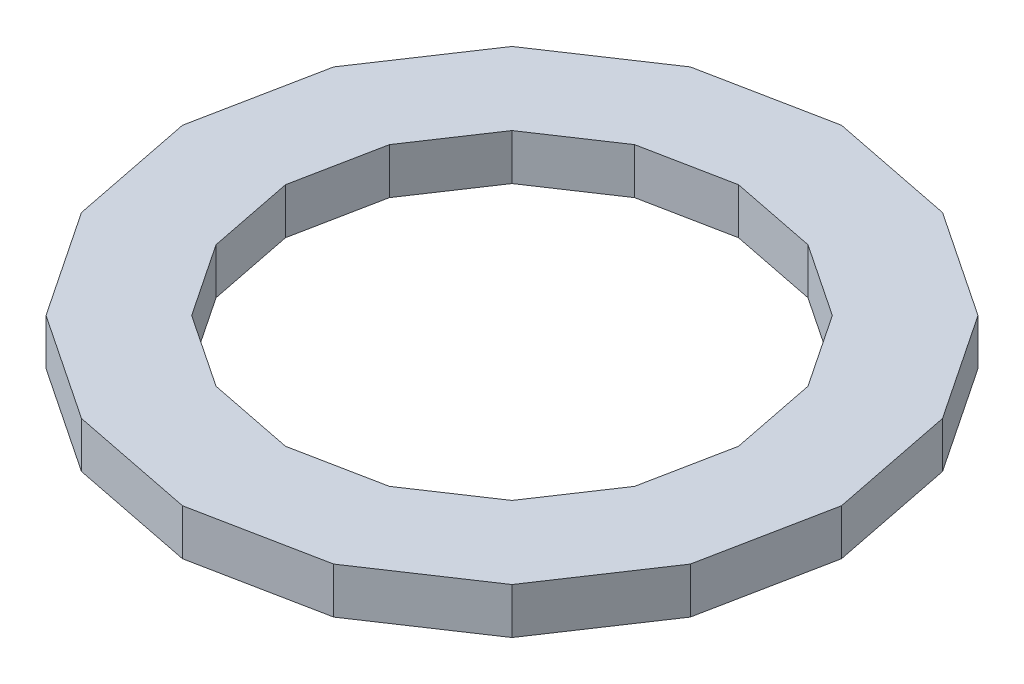
ISO-10303-21;
HEADER;
FILE_DESCRIPTION(('STEP AP214'),'2;1');
FILE_NAME('part.step','',(''),(''),'','','');
FILE_SCHEMA(('AUTOMOTIVE_DESIGN { 1 0 10303 214 1 1 1 1 }'));
ENDSEC;
DATA;
#1=APPLICATION_CONTEXT('core data for automotive mechanical design processes');
#2=APPLICATION_PROTOCOL_DEFINITION('international standard','automotive_design',2000,#1);
#3=PRODUCT_CONTEXT('',#1,'mechanical');
#4=PRODUCT('Part','Part','',(#3));
#5=PRODUCT_RELATED_PRODUCT_CATEGORY('part','',(#4));
#6=PRODUCT_DEFINITION_FORMATION('','',#4);
#7=PRODUCT_DEFINITION_CONTEXT('part definition',#1,'design');
#8=PRODUCT_DEFINITION('design','',#6,#7);
#9=PRODUCT_DEFINITION_SHAPE('','',#8);
#10=(LENGTH_UNIT() NAMED_UNIT(*) SI_UNIT(.MILLI.,.METRE.));
#11=(NAMED_UNIT(*) PLANE_ANGLE_UNIT() SI_UNIT($,.RADIAN.));
#12=(NAMED_UNIT(*) SI_UNIT($,.STERADIAN.) SOLID_ANGLE_UNIT());
#13=UNCERTAINTY_MEASURE_WITH_UNIT(LENGTH_MEASURE(1.E-05),#10,'distance_accuracy_value','');
#14=(GEOMETRIC_REPRESENTATION_CONTEXT(3) GLOBAL_UNCERTAINTY_ASSIGNED_CONTEXT((#13)) GLOBAL_UNIT_ASSIGNED_CONTEXT((#10,
#11,#12)) REPRESENTATION_CONTEXT('',''));
#15=CARTESIAN_POINT('',(0.,0.,0.));
#16=DIRECTION('',(0.,0.,1.));
#17=DIRECTION('',(1.,0.,0.));
#18=AXIS2_PLACEMENT_3D('',#15,#16,#17);
#19=CARTESIAN_POINT('',(0.,19.05,0.));
#20=DIRECTION('',(0.,1.,0.));
#21=DIRECTION('',(0.,0.,1.));
#22=AXIS2_PLACEMENT_3D('',#19,#20,#21);
#23=PLANE('',#22);
#24=DIRECTION('',(0.195090322016116,0.,-0.980785280403233));
#25=VECTOR('',#24,1.);
#26=CARTESIAN_POINT('',(126.299792206192,19.05,52.3150868567067));
#27=LINE('',#26,#25);
#28=CARTESIAN_POINT('',(126.299792206192,19.05,52.3150868567067));
#29=VERTEX_POINT('',#28);
#30=CARTESIAN_POINT('',(136.705909982532,19.05,-1.67573348599934E-12));
#31=VERTEX_POINT('',#30);
#32=EDGE_CURVE('E377',#29,#31,#27,.T.);
#33=ORIENTED_EDGE('',*,*,#32,.T.);
#34=DIRECTION('',(-0.19509032201614,0.,-0.980785280403228));
#35=VECTOR('',#34,1.);
#36=CARTESIAN_POINT('',(136.705909982532,19.05,-1.67573348599934E-12));
#37=LINE('',#36,#35);
#38=CARTESIAN_POINT('',(126.299792206191,19.05,-52.3150868567099));
#39=VERTEX_POINT('',#38);
#40=EDGE_CURVE('E381',#31,#39,#37,.T.);
#41=ORIENTED_EDGE('',*,*,#40,.T.);
#42=DIRECTION('',(-0.555570233019613,0.,-0.831469612302538));
#43=VECTOR('',#42,1.);
#44=CARTESIAN_POINT('',(126.299792206191,19.05,-52.3150868567099));
#45=LINE('',#44,#43);
#46=CARTESIAN_POINT('',(96.6656759769248,19.05,-96.6656759769271));
#47=VERTEX_POINT('',#46);
#48=EDGE_CURVE('E385',#39,#47,#45,.T.);
#49=ORIENTED_EDGE('',*,*,#48,.T.);
#50=DIRECTION('',(-0.831469612302552,0.,-0.555570233019592));
#51=VECTOR('',#50,1.);
#52=CARTESIAN_POINT('',(96.6656759769248,19.05,-96.6656759769271));
#53=LINE('',#52,#51);
#54=CARTESIAN_POINT('',(52.3150868567067,19.05,-126.299792206192));
#55=VERTEX_POINT('',#54);
#56=EDGE_CURVE('E388',#47,#55,#53,.T.);
#57=ORIENTED_EDGE('',*,*,#56,.T.);
#58=DIRECTION('',(-0.980785280403233,0.,-0.195090322016116));
#59=VECTOR('',#58,1.);
#60=CARTESIAN_POINT('',(52.3150868567067,19.05,-126.299792206192));
#61=LINE('',#60,#59);
#62=CARTESIAN_POINT('',(-1.77644044510721E-12,19.05,-136.705909982532));
#63=VERTEX_POINT('',#62);
#64=EDGE_CURVE('E390',#55,#63,#61,.T.);
#65=ORIENTED_EDGE('',*,*,#64,.T.);
#66=DIRECTION('',(-0.980785280403228,0.,0.19509032201614));
#67=VECTOR('',#66,1.);
#68=CARTESIAN_POINT('',(-1.77644044510721E-12,19.05,-136.705909982532));
#69=LINE('',#68,#67);
#70=CARTESIAN_POINT('',(-52.3150868567098,19.05,-126.299792206191));
#71=VERTEX_POINT('',#70);
#72=EDGE_CURVE('E392',#63,#71,#69,.T.);
#73=ORIENTED_EDGE('',*,*,#72,.T.);
#74=DIRECTION('',(-0.831469612302539,0.,0.555570233019612));
#75=VECTOR('',#74,1.);
#76=CARTESIAN_POINT('',(-52.3150868567098,19.05,-126.299792206191));
#77=LINE('',#76,#75);
#78=CARTESIAN_POINT('',(-96.6656759769271,19.05,-96.6656759769248));
#79=VERTEX_POINT('',#78);
#80=EDGE_CURVE('E394',#71,#79,#77,.T.);
#81=ORIENTED_EDGE('',*,*,#80,.T.);
#82=DIRECTION('',(-0.555570233019592,0.,0.831469612302552));
#83=VECTOR('',#82,1.);
#84=CARTESIAN_POINT('',(-96.6656759769271,19.05,-96.6656759769248));
#85=LINE('',#84,#83);
#86=CARTESIAN_POINT('',(-126.299792206192,19.05,-52.3150868567067));
#87=VERTEX_POINT('',#86);
#88=EDGE_CURVE('E396',#79,#87,#85,.T.);
#89=ORIENTED_EDGE('',*,*,#88,.T.);
#90=DIRECTION('',(-0.195090322016116,0.,0.980785280403233));
#91=VECTOR('',#90,1.);
#92=CARTESIAN_POINT('',(-126.299792206192,19.05,-52.3150868567067));
#93=LINE('',#92,#91);
#94=CARTESIAN_POINT('',(-136.705909982532,19.05,1.66525605076206E-12));
#95=VERTEX_POINT('',#94);
#96=EDGE_CURVE('E398',#87,#95,#93,.T.);
#97=ORIENTED_EDGE('',*,*,#96,.T.);
#98=DIRECTION('',(0.19509032201614,0.,0.980785280403228));
#99=VECTOR('',#98,1.);
#100=CARTESIAN_POINT('',(-136.705909982532,19.05,1.66525605076206E-12));
#101=LINE('',#100,#99);
#102=CARTESIAN_POINT('',(-126.299792206191,19.05,52.3150868567097));
#103=VERTEX_POINT('',#102);
#104=EDGE_CURVE('E400',#95,#103,#101,.T.);
#105=ORIENTED_EDGE('',*,*,#104,.T.);
#106=DIRECTION('',(0.555570233019612,0.,0.831469612302539));
#107=VECTOR('',#106,1.);
#108=CARTESIAN_POINT('',(-126.299792206191,19.05,52.3150868567097));
#109=LINE('',#108,#107);
#110=CARTESIAN_POINT('',(-96.6656759769247,19.05,96.6656759769272));
#111=VERTEX_POINT('',#110);
#112=EDGE_CURVE('E402',#103,#111,#109,.T.);
#113=ORIENTED_EDGE('',*,*,#112,.T.);
#114=DIRECTION('',(0.831469612302552,0.,0.555570233019592));
#115=VECTOR('',#114,1.);
#116=CARTESIAN_POINT('',(-96.6656759769247,19.05,96.6656759769272));
#117=LINE('',#116,#115);
#118=CARTESIAN_POINT('',(-52.3150868567066,19.05,126.299792206192));
#119=VERTEX_POINT('',#118);
#120=EDGE_CURVE('E404',#111,#119,#117,.T.);
#121=ORIENTED_EDGE('',*,*,#120,.T.);
#122=DIRECTION('',(0.980785280403233,0.,0.195090322016116));
#123=VECTOR('',#122,1.);
#124=CARTESIAN_POINT('',(-52.3150868567066,19.05,126.299792206192));
#125=LINE('',#124,#123);
#126=CARTESIAN_POINT('',(1.67774687430554E-12,19.05,136.705909982532));
#127=VERTEX_POINT('',#126);
#128=EDGE_CURVE('E406',#119,#127,#125,.T.);
#129=ORIENTED_EDGE('',*,*,#128,.T.);
#130=DIRECTION('',(0.980785280403228,0.,-0.19509032201614));
#131=VECTOR('',#130,1.);
#132=CARTESIAN_POINT('',(1.67774687430554E-12,19.05,136.705909982532));
#133=LINE('',#132,#131);
#134=CARTESIAN_POINT('',(52.3150868567097,19.05,126.299792206191));
#135=VERTEX_POINT('',#134);
#136=EDGE_CURVE('E408',#127,#135,#133,.T.);
#137=ORIENTED_EDGE('',*,*,#136,.T.);
#138=DIRECTION('',(0.831469612302539,0.,-0.555570233019612));
#139=VECTOR('',#138,1.);
#140=CARTESIAN_POINT('',(52.3150868567097,19.05,126.299792206191));
#141=LINE('',#140,#139);
#142=CARTESIAN_POINT('',(96.6656759769271,19.05,96.6656759769248));
#143=VERTEX_POINT('',#142);
#144=EDGE_CURVE('E410',#135,#143,#141,.T.);
#145=ORIENTED_EDGE('',*,*,#144,.T.);
#146=DIRECTION('',(0.555570233019592,0.,-0.831469612302552));
#147=VECTOR('',#146,1.);
#148=CARTESIAN_POINT('',(96.6656759769271,19.05,96.6656759769248));
#149=LINE('',#148,#147);
#150=EDGE_CURVE('E412',#143,#29,#149,.T.);
#151=ORIENTED_EDGE('',*,*,#150,.T.);
#152=EDGE_LOOP('',(#33,#41,#49,#57,#65,#73,#81,#89,#97,#105,#113,#121,#129,#137,#145,#151));
#153=FACE_BOUND('',#152,.T.);
#154=DIRECTION('',(-0.195090322016141,0.,-0.980785280403228));
#155=VECTOR('',#154,1.);
#156=CARTESIAN_POINT('',(93.9748445420212,19.05,-1.17238093129453E-12));
#157=LINE('',#156,#155);
#158=CARTESIAN_POINT('',(93.9748445420212,19.05,-1.17238093129453E-12));
#159=VERTEX_POINT('',#158);
#160=CARTESIAN_POINT('',(86.8214354433029,19.05,-35.9626160653175));
#161=VERTEX_POINT('',#160);
#162=EDGE_CURVE('E253',#159,#161,#157,.T.);
#163=ORIENTED_EDGE('',*,*,#162,.F.);
#164=DIRECTION('',(0.195090322016116,0.,-0.980785280403233));
#165=VECTOR('',#164,1.);
#166=CARTESIAN_POINT('',(86.8214354433038,19.05,35.9626160653153));
#167=LINE('',#166,#165);
#168=CARTESIAN_POINT('',(86.8214354433038,19.05,35.9626160653153));
#169=VERTEX_POINT('',#168);
#170=EDGE_CURVE('E244',#169,#159,#167,.T.);
#171=ORIENTED_EDGE('',*,*,#170,.F.);
#172=DIRECTION('',(0.555570233019592,0.,-0.831469612302552));
#173=VECTOR('',#172,1.);
#174=CARTESIAN_POINT('',(66.4502498366156,19.05,66.450249836614));
#175=LINE('',#174,#173);
#176=CARTESIAN_POINT('',(66.4502498366156,19.05,66.450249836614));
#177=VERTEX_POINT('',#176);
#178=EDGE_CURVE('E302',#177,#169,#175,.T.);
#179=ORIENTED_EDGE('',*,*,#178,.F.);
#180=DIRECTION('',(0.831469612302538,0.,-0.555570233019613));
#181=VECTOR('',#180,1.);
#182=CARTESIAN_POINT('',(35.9626160653175,19.05,86.8214354433029));
#183=LINE('',#182,#181);
#184=CARTESIAN_POINT('',(35.9626160653175,19.05,86.8214354433029));
#185=VERTEX_POINT('',#184);
#186=EDGE_CURVE('E300',#185,#177,#183,.T.);
#187=ORIENTED_EDGE('',*,*,#186,.F.);
#188=DIRECTION('',(0.980785280403228,0.,-0.19509032201614));
#189=VECTOR('',#188,1.);
#190=CARTESIAN_POINT('',(1.12168126853505E-12,19.05,93.9748445420212));
#191=LINE('',#190,#189);
#192=CARTESIAN_POINT('',(1.12168126853505E-12,19.05,93.9748445420212));
#193=VERTEX_POINT('',#192);
#194=EDGE_CURVE('E298',#193,#185,#191,.T.);
#195=ORIENTED_EDGE('',*,*,#194,.F.);
#196=DIRECTION('',(0.980785280403233,0.,0.195090322016116));
#197=VECTOR('',#196,1.);
#198=CARTESIAN_POINT('',(-35.9626160653153,19.05,86.8214354433039));
#199=LINE('',#198,#197);
#200=CARTESIAN_POINT('',(-35.9626160653153,19.05,86.8214354433039));
#201=VERTEX_POINT('',#200);
#202=EDGE_CURVE('E296',#201,#193,#199,.T.);
#203=ORIENTED_EDGE('',*,*,#202,.F.);
#204=DIRECTION('',(0.831469612302552,0.,0.555570233019592));
#205=VECTOR('',#204,1.);
#206=CARTESIAN_POINT('',(-66.4502498366139,19.05,66.4502498366157));
#207=LINE('',#206,#205);
#208=CARTESIAN_POINT('',(-66.4502498366139,19.05,66.4502498366157));
#209=VERTEX_POINT('',#208);
#210=EDGE_CURVE('E294',#209,#201,#207,.T.);
#211=ORIENTED_EDGE('',*,*,#210,.F.);
#212=DIRECTION('',(0.555570233019613,0.,0.831469612302538));
#213=VECTOR('',#212,1.);
#214=CARTESIAN_POINT('',(-86.8214354433029,19.05,35.9626160653175));
#215=LINE('',#214,#213);
#216=CARTESIAN_POINT('',(-86.8214354433029,19.05,35.9626160653175));
#217=VERTEX_POINT('',#216);
#218=EDGE_CURVE('E291',#217,#209,#215,.T.);
#219=ORIENTED_EDGE('',*,*,#218,.F.);
#220=DIRECTION('',(0.195090322016141,0.,0.980785280403228));
#221=VECTOR('',#220,1.);
#222=CARTESIAN_POINT('',(-93.9748445420212,19.05,1.18614690458019E-12));
#223=LINE('',#222,#221);
#224=CARTESIAN_POINT('',(-93.9748445420212,19.05,1.18614690458019E-12));
#225=VERTEX_POINT('',#224);
#226=EDGE_CURVE('E289',#225,#217,#223,.T.);
#227=ORIENTED_EDGE('',*,*,#226,.F.);
#228=DIRECTION('',(-0.195090322016116,0.,0.980785280403233));
#229=VECTOR('',#228,1.);
#230=CARTESIAN_POINT('',(-86.8214354433038,19.05,-35.9626160653153));
#231=LINE('',#230,#229);
#232=CARTESIAN_POINT('',(-86.8214354433038,19.05,-35.9626160653153));
#233=VERTEX_POINT('',#232);
#234=EDGE_CURVE('E286',#233,#225,#231,.T.);
#235=ORIENTED_EDGE('',*,*,#234,.F.);
#236=DIRECTION('',(-0.555570233019592,0.,0.831469612302552));
#237=VECTOR('',#236,1.);
#238=CARTESIAN_POINT('',(-66.4502498366156,19.05,-66.4502498366139));
#239=LINE('',#238,#237);
#240=CARTESIAN_POINT('',(-66.4502498366156,19.05,-66.4502498366139));
#241=VERTEX_POINT('',#240);
#242=EDGE_CURVE('E284',#241,#233,#239,.T.);
#243=ORIENTED_EDGE('',*,*,#242,.F.);
#244=DIRECTION('',(-0.831469612302538,0.,0.555570233019613));
#245=VECTOR('',#244,1.);
#246=CARTESIAN_POINT('',(-35.9626160653174,19.05,-86.8214354433029));
#247=LINE('',#246,#245);
#248=CARTESIAN_POINT('',(-35.9626160653174,19.05,-86.8214354433029));
#249=VERTEX_POINT('',#248);
#250=EDGE_CURVE('E281',#249,#241,#247,.T.);
#251=ORIENTED_EDGE('',*,*,#250,.F.);
#252=DIRECTION('',(-0.980785280403228,0.,0.195090322016141));
#253=VECTOR('',#252,1.);
#254=CARTESIAN_POINT('',(-1.13138613242558E-12,19.05,-93.9748445420212));
#255=LINE('',#254,#253);
#256=CARTESIAN_POINT('',(-1.13138613242558E-12,19.05,-93.9748445420212));
#257=VERTEX_POINT('',#256);
#258=EDGE_CURVE('E279',#257,#249,#255,.T.);
#259=ORIENTED_EDGE('',*,*,#258,.F.);
#260=DIRECTION('',(-0.980785280403233,0.,-0.195090322016116));
#261=VECTOR('',#260,1.);
#262=CARTESIAN_POINT('',(35.9626160653152,19.05,-86.8214354433039));
#263=LINE('',#262,#261);
#264=CARTESIAN_POINT('',(35.9626160653152,19.05,-86.8214354433039));
#265=VERTEX_POINT('',#264);
#266=EDGE_CURVE('E277',#265,#257,#263,.T.);
#267=ORIENTED_EDGE('',*,*,#266,.F.);
#268=DIRECTION('',(-0.831469612302552,0.,-0.555570233019592));
#269=VECTOR('',#268,1.);
#270=CARTESIAN_POINT('',(66.450249836614,19.05,-66.4502498366156));
#271=LINE('',#270,#269);
#272=CARTESIAN_POINT('',(66.450249836614,19.05,-66.4502498366156));
#273=VERTEX_POINT('',#272);
#274=EDGE_CURVE('E272',#273,#265,#271,.T.);
#275=ORIENTED_EDGE('',*,*,#274,.F.);
#276=DIRECTION('',(-0.555570233019612,0.,-0.831469612302538));
#277=VECTOR('',#276,1.);
#278=CARTESIAN_POINT('',(86.8214354433029,19.05,-35.9626160653175));
#279=LINE('',#278,#277);
#280=EDGE_CURVE('E266',#161,#273,#279,.T.);
#281=ORIENTED_EDGE('',*,*,#280,.F.);
#282=EDGE_LOOP('',(#163,#171,#179,#187,#195,#203,#211,#219,#227,#235,#243,#251,#259,#267,#275,#281));
#283=FACE_BOUND('',#282,.T.);
#284=ADVANCED_FACE('F35',(#153,#283),#23,.T.);
#285=CARTESIAN_POINT('',(0.,0.,0.));
#286=DIRECTION('',(0.,1.,0.));
#287=DIRECTION('',(0.,0.,1.));
#288=AXIS2_PLACEMENT_3D('',#285,#286,#287);
#289=PLANE('',#288);
#290=DIRECTION('',(0.195090322016116,0.,-0.980785280403233));
#291=VECTOR('',#290,1.);
#292=CARTESIAN_POINT('',(126.299792206192,0.,52.3150868567067));
#293=LINE('',#292,#291);
#294=CARTESIAN_POINT('',(126.299792206192,0.,52.3150868567067));
#295=VERTEX_POINT('',#294);
#296=CARTESIAN_POINT('',(136.705909982532,0.,-1.67573348599934E-12));
#297=VERTEX_POINT('',#296);
#298=EDGE_CURVE('E261',#295,#297,#293,.T.);
#299=ORIENTED_EDGE('',*,*,#298,.F.);
#300=DIRECTION('',(0.555570233019592,0.,-0.831469612302552));
#301=VECTOR('',#300,1.);
#302=CARTESIAN_POINT('',(96.6656759769271,0.,96.6656759769248));
#303=LINE('',#302,#301);
#304=CARTESIAN_POINT('',(96.6656759769271,0.,96.6656759769248));
#305=VERTEX_POINT('',#304);
#306=EDGE_CURVE('E382',#305,#295,#303,.T.);
#307=ORIENTED_EDGE('',*,*,#306,.F.);
#308=DIRECTION('',(0.831469612302539,0.,-0.555570233019612));
#309=VECTOR('',#308,1.);
#310=CARTESIAN_POINT('',(52.3150868567097,0.,126.299792206191));
#311=LINE('',#310,#309);
#312=CARTESIAN_POINT('',(52.3150868567097,0.,126.299792206191));
#313=VERTEX_POINT('',#312);
#314=EDGE_CURVE('E445',#313,#305,#311,.T.);
#315=ORIENTED_EDGE('',*,*,#314,.F.);
#316=DIRECTION('',(0.980785280403228,0.,-0.19509032201614));
#317=VECTOR('',#316,1.);
#318=CARTESIAN_POINT('',(1.67774687430554E-12,0.,136.705909982532));
#319=LINE('',#318,#317);
#320=CARTESIAN_POINT('',(1.67774687430554E-12,0.,136.705909982532));
#321=VERTEX_POINT('',#320);
#322=EDGE_CURVE('E443',#321,#313,#319,.T.);
#323=ORIENTED_EDGE('',*,*,#322,.F.);
#324=DIRECTION('',(0.980785280403233,0.,0.195090322016116));
#325=VECTOR('',#324,1.);
#326=CARTESIAN_POINT('',(-52.3150868567066,0.,126.299792206192));
#327=LINE('',#326,#325);
#328=CARTESIAN_POINT('',(-52.3150868567066,0.,126.299792206192));
#329=VERTEX_POINT('',#328);
#330=EDGE_CURVE('E441',#329,#321,#327,.T.);
#331=ORIENTED_EDGE('',*,*,#330,.F.);
#332=DIRECTION('',(0.831469612302552,0.,0.555570233019592));
#333=VECTOR('',#332,1.);
#334=CARTESIAN_POINT('',(-96.6656759769247,0.,96.6656759769272));
#335=LINE('',#334,#333);
#336=CARTESIAN_POINT('',(-96.6656759769247,0.,96.6656759769272));
#337=VERTEX_POINT('',#336);
#338=EDGE_CURVE('E439',#337,#329,#335,.T.);
#339=ORIENTED_EDGE('',*,*,#338,.F.);
#340=DIRECTION('',(0.555570233019612,0.,0.831469612302539));
#341=VECTOR('',#340,1.);
#342=CARTESIAN_POINT('',(-126.299792206191,0.,52.3150868567097));
#343=LINE('',#342,#341);
#344=CARTESIAN_POINT('',(-126.299792206191,0.,52.3150868567097));
#345=VERTEX_POINT('',#344);
#346=EDGE_CURVE('E437',#345,#337,#343,.T.);
#347=ORIENTED_EDGE('',*,*,#346,.F.);
#348=DIRECTION('',(0.19509032201614,0.,0.980785280403228));
#349=VECTOR('',#348,1.);
#350=CARTESIAN_POINT('',(-136.705909982532,0.,1.66525605076206E-12));
#351=LINE('',#350,#349);
#352=CARTESIAN_POINT('',(-136.705909982532,0.,1.66525605076206E-12));
#353=VERTEX_POINT('',#352);
#354=EDGE_CURVE('E435',#353,#345,#351,.T.);
#355=ORIENTED_EDGE('',*,*,#354,.F.);
#356=DIRECTION('',(-0.195090322016116,0.,0.980785280403233));
#357=VECTOR('',#356,1.);
#358=CARTESIAN_POINT('',(-126.299792206192,0.,-52.3150868567067));
#359=LINE('',#358,#357);
#360=CARTESIAN_POINT('',(-126.299792206192,0.,-52.3150868567067));
#361=VERTEX_POINT('',#360);
#362=EDGE_CURVE('E433',#361,#353,#359,.T.);
#363=ORIENTED_EDGE('',*,*,#362,.F.);
#364=DIRECTION('',(-0.555570233019592,0.,0.831469612302552));
#365=VECTOR('',#364,1.);
#366=CARTESIAN_POINT('',(-96.6656759769271,0.,-96.6656759769248));
#367=LINE('',#366,#365);
#368=CARTESIAN_POINT('',(-96.6656759769271,0.,-96.6656759769248));
#369=VERTEX_POINT('',#368);
#370=EDGE_CURVE('E431',#369,#361,#367,.T.);
#371=ORIENTED_EDGE('',*,*,#370,.F.);
#372=DIRECTION('',(-0.831469612302539,0.,0.555570233019612));
#373=VECTOR('',#372,1.);
#374=CARTESIAN_POINT('',(-52.3150868567098,0.,-126.299792206191));
#375=LINE('',#374,#373);
#376=CARTESIAN_POINT('',(-52.3150868567098,0.,-126.299792206191));
#377=VERTEX_POINT('',#376);
#378=EDGE_CURVE('E429',#377,#369,#375,.T.);
#379=ORIENTED_EDGE('',*,*,#378,.F.);
#380=DIRECTION('',(-0.980785280403228,0.,0.19509032201614));
#381=VECTOR('',#380,1.);
#382=CARTESIAN_POINT('',(-1.77644044510721E-12,0.,-136.705909982532));
#383=LINE('',#382,#381);
#384=CARTESIAN_POINT('',(-1.77644044510721E-12,0.,-136.705909982532));
#385=VERTEX_POINT('',#384);
#386=EDGE_CURVE('E427',#385,#377,#383,.T.);
#387=ORIENTED_EDGE('',*,*,#386,.F.);
#388=DIRECTION('',(-0.980785280403233,0.,-0.195090322016116));
#389=VECTOR('',#388,1.);
#390=CARTESIAN_POINT('',(52.3150868567067,0.,-126.299792206192));
#391=LINE('',#390,#389);
#392=CARTESIAN_POINT('',(52.3150868567067,0.,-126.299792206192));
#393=VERTEX_POINT('',#392);
#394=EDGE_CURVE('E425',#393,#385,#391,.T.);
#395=ORIENTED_EDGE('',*,*,#394,.F.);
#396=DIRECTION('',(-0.831469612302552,0.,-0.555570233019592));
#397=VECTOR('',#396,1.);
#398=CARTESIAN_POINT('',(96.6656759769248,0.,-96.6656759769271));
#399=LINE('',#398,#397);
#400=CARTESIAN_POINT('',(96.6656759769248,0.,-96.6656759769271));
#401=VERTEX_POINT('',#400);
#402=EDGE_CURVE('E423',#401,#393,#399,.T.);
#403=ORIENTED_EDGE('',*,*,#402,.F.);
#404=DIRECTION('',(-0.555570233019613,0.,-0.831469612302538));
#405=VECTOR('',#404,1.);
#406=CARTESIAN_POINT('',(126.299792206191,0.,-52.3150868567099));
#407=LINE('',#406,#405);
#408=CARTESIAN_POINT('',(126.299792206191,0.,-52.3150868567099));
#409=VERTEX_POINT('',#408);
#410=EDGE_CURVE('E420',#409,#401,#407,.T.);
#411=ORIENTED_EDGE('',*,*,#410,.F.);
#412=DIRECTION('',(-0.19509032201614,0.,-0.980785280403228));
#413=VECTOR('',#412,1.);
#414=CARTESIAN_POINT('',(136.705909982532,0.,-1.67573348599934E-12));
#415=LINE('',#414,#413);
#416=EDGE_CURVE('E417',#297,#409,#415,.T.);
#417=ORIENTED_EDGE('',*,*,#416,.F.);
#418=EDGE_LOOP('',(#299,#307,#315,#323,#331,#339,#347,#355,#363,#371,#379,#387,#395,#403,#411,#417));
#419=FACE_BOUND('',#418,.T.);
#420=DIRECTION('',(0.195090322016116,0.,-0.980785280403233));
#421=VECTOR('',#420,1.);
#422=CARTESIAN_POINT('',(86.8214354433038,0.,35.9626160653153));
#423=LINE('',#422,#421);
#424=CARTESIAN_POINT('',(86.8214354433038,0.,35.9626160653153));
#425=VERTEX_POINT('',#424);
#426=CARTESIAN_POINT('',(93.9748445420212,0.,-1.17238093129453E-12));
#427=VERTEX_POINT('',#426);
#428=EDGE_CURVE('E58',#425,#427,#423,.T.);
#429=ORIENTED_EDGE('',*,*,#428,.T.);
#430=DIRECTION('',(-0.195090322016141,0.,-0.980785280403228));
#431=VECTOR('',#430,1.);
#432=CARTESIAN_POINT('',(93.9748445420212,0.,-1.17238093129453E-12));
#433=LINE('',#432,#431);
#434=CARTESIAN_POINT('',(86.8214354433029,0.,-35.9626160653175));
#435=VERTEX_POINT('',#434);
#436=EDGE_CURVE('E260',#427,#435,#433,.T.);
#437=ORIENTED_EDGE('',*,*,#436,.T.);
#438=DIRECTION('',(-0.555570233019612,0.,-0.831469612302538));
#439=VECTOR('',#438,1.);
#440=CARTESIAN_POINT('',(86.8214354433029,0.,-35.9626160653175));
#441=LINE('',#440,#439);
#442=CARTESIAN_POINT('',(66.450249836614,0.,-66.4502498366156));
#443=VERTEX_POINT('',#442);
#444=EDGE_CURVE('E308',#435,#443,#441,.T.);
#445=ORIENTED_EDGE('',*,*,#444,.T.);
#446=DIRECTION('',(-0.831469612302552,0.,-0.555570233019592));
#447=VECTOR('',#446,1.);
#448=CARTESIAN_POINT('',(66.450249836614,0.,-66.4502498366156));
#449=LINE('',#448,#447);
#450=CARTESIAN_POINT('',(35.9626160653152,0.,-86.8214354433039));
#451=VERTEX_POINT('',#450);
#452=EDGE_CURVE('E311',#443,#451,#449,.T.);
#453=ORIENTED_EDGE('',*,*,#452,.T.);
#454=DIRECTION('',(-0.980785280403233,0.,-0.195090322016116));
#455=VECTOR('',#454,1.);
#456=CARTESIAN_POINT('',(35.9626160653152,0.,-86.8214354433039));
#457=LINE('',#456,#455);
#458=CARTESIAN_POINT('',(-1.13138613242558E-12,0.,-93.9748445420212));
#459=VERTEX_POINT('',#458);
#460=EDGE_CURVE('E314',#451,#459,#457,.T.);
#461=ORIENTED_EDGE('',*,*,#460,.T.);
#462=DIRECTION('',(-0.980785280403228,0.,0.195090322016141));
#463=VECTOR('',#462,1.);
#464=CARTESIAN_POINT('',(-1.13138613242558E-12,0.,-93.9748445420212));
#465=LINE('',#464,#463);
#466=CARTESIAN_POINT('',(-35.9626160653174,0.,-86.8214354433029));
#467=VERTEX_POINT('',#466);
#468=EDGE_CURVE('E317',#459,#467,#465,.T.);
#469=ORIENTED_EDGE('',*,*,#468,.T.);
#470=DIRECTION('',(-0.831469612302538,0.,0.555570233019613));
#471=VECTOR('',#470,1.);
#472=CARTESIAN_POINT('',(-35.9626160653174,0.,-86.8214354433029));
#473=LINE('',#472,#471);
#474=CARTESIAN_POINT('',(-66.4502498366156,0.,-66.4502498366139));
#475=VERTEX_POINT('',#474);
#476=EDGE_CURVE('E320',#467,#475,#473,.T.);
#477=ORIENTED_EDGE('',*,*,#476,.T.);
#478=DIRECTION('',(-0.555570233019592,0.,0.831469612302552));
#479=VECTOR('',#478,1.);
#480=CARTESIAN_POINT('',(-66.4502498366156,0.,-66.4502498366139));
#481=LINE('',#480,#479);
#482=CARTESIAN_POINT('',(-86.8214354433038,0.,-35.9626160653153));
#483=VERTEX_POINT('',#482);
#484=EDGE_CURVE('E324',#475,#483,#481,.T.);
#485=ORIENTED_EDGE('',*,*,#484,.T.);
#486=DIRECTION('',(-0.195090322016116,0.,0.980785280403233));
#487=VECTOR('',#486,1.);
#488=CARTESIAN_POINT('',(-86.8214354433038,0.,-35.9626160653153));
#489=LINE('',#488,#487);
#490=CARTESIAN_POINT('',(-93.9748445420212,0.,1.18614690458019E-12));
#491=VERTEX_POINT('',#490);
#492=EDGE_CURVE('E327',#483,#491,#489,.T.);
#493=ORIENTED_EDGE('',*,*,#492,.T.);
#494=DIRECTION('',(0.195090322016141,0.,0.980785280403228));
#495=VECTOR('',#494,1.);
#496=CARTESIAN_POINT('',(-93.9748445420212,0.,1.18614690458019E-12));
#497=LINE('',#496,#495);
#498=CARTESIAN_POINT('',(-86.8214354433029,0.,35.9626160653175));
#499=VERTEX_POINT('',#498);
#500=EDGE_CURVE('E330',#491,#499,#497,.T.);
#501=ORIENTED_EDGE('',*,*,#500,.T.);
#502=DIRECTION('',(0.555570233019613,0.,0.831469612302538));
#503=VECTOR('',#502,1.);
#504=CARTESIAN_POINT('',(-86.8214354433029,0.,35.9626160653175));
#505=LINE('',#504,#503);
#506=CARTESIAN_POINT('',(-66.4502498366139,0.,66.4502498366157));
#507=VERTEX_POINT('',#506);
#508=EDGE_CURVE('E333',#499,#507,#505,.T.);
#509=ORIENTED_EDGE('',*,*,#508,.T.);
#510=DIRECTION('',(0.831469612302552,0.,0.555570233019592));
#511=VECTOR('',#510,1.);
#512=CARTESIAN_POINT('',(-66.4502498366139,0.,66.4502498366157));
#513=LINE('',#512,#511);
#514=CARTESIAN_POINT('',(-35.9626160653153,0.,86.8214354433039));
#515=VERTEX_POINT('',#514);
#516=EDGE_CURVE('E336',#507,#515,#513,.T.);
#517=ORIENTED_EDGE('',*,*,#516,.T.);
#518=DIRECTION('',(0.980785280403233,0.,0.195090322016116));
#519=VECTOR('',#518,1.);
#520=CARTESIAN_POINT('',(-35.9626160653153,0.,86.8214354433039));
#521=LINE('',#520,#519);
#522=CARTESIAN_POINT('',(1.12168126853505E-12,0.,93.9748445420212));
#523=VERTEX_POINT('',#522);
#524=EDGE_CURVE('E339',#515,#523,#521,.T.);
#525=ORIENTED_EDGE('',*,*,#524,.T.);
#526=DIRECTION('',(0.980785280403228,0.,-0.19509032201614));
#527=VECTOR('',#526,1.);
#528=CARTESIAN_POINT('',(1.12168126853505E-12,0.,93.9748445420212));
#529=LINE('',#528,#527);
#530=CARTESIAN_POINT('',(35.9626160653175,0.,86.8214354433029));
#531=VERTEX_POINT('',#530);
#532=EDGE_CURVE('E342',#523,#531,#529,.T.);
#533=ORIENTED_EDGE('',*,*,#532,.T.);
#534=DIRECTION('',(0.831469612302538,0.,-0.555570233019613));
#535=VECTOR('',#534,1.);
#536=CARTESIAN_POINT('',(35.9626160653175,0.,86.8214354433029));
#537=LINE('',#536,#535);
#538=CARTESIAN_POINT('',(66.4502498366156,0.,66.450249836614));
#539=VERTEX_POINT('',#538);
#540=EDGE_CURVE('E345',#531,#539,#537,.T.);
#541=ORIENTED_EDGE('',*,*,#540,.T.);
#542=DIRECTION('',(0.555570233019592,0.,-0.831469612302552));
#543=VECTOR('',#542,1.);
#544=CARTESIAN_POINT('',(66.4502498366156,0.,66.450249836614));
#545=LINE('',#544,#543);
#546=EDGE_CURVE('E254',#539,#425,#545,.T.);
#547=ORIENTED_EDGE('',*,*,#546,.T.);
#548=EDGE_LOOP('',(#429,#437,#445,#453,#461,#469,#477,#485,#493,#501,#509,#517,#525,#533,#541,#547));
#549=FACE_BOUND('',#548,.T.);
#550=ADVANCED_FACE('F499',(#419,#549),#289,.F.);
#551=CARTESIAN_POINT('',(126.299792206192,19.05,52.3150868567067));
#552=DIRECTION('',(-0.980785280403233,0.,-0.195090322016116));
#553=DIRECTION('',(-0.195090322016116,0.,0.980785280403233));
#554=AXIS2_PLACEMENT_3D('',#551,#552,#553);
#555=PLANE('',#554);
#556=ORIENTED_EDGE('',*,*,#298,.T.);
#557=DIRECTION('',(0.,-1.,0.));
#558=VECTOR('',#557,1.);
#559=CARTESIAN_POINT('',(136.705909982532,19.05,-1.67573348599934E-12));
#560=LINE('',#559,#558);
#561=EDGE_CURVE('E11',#31,#297,#560,.T.);
#562=ORIENTED_EDGE('',*,*,#561,.F.);
#563=ORIENTED_EDGE('',*,*,#32,.F.);
#564=DIRECTION('',(0.,-1.,0.));
#565=VECTOR('',#564,1.);
#566=CARTESIAN_POINT('',(126.299792206192,19.05,52.3150868567067));
#567=LINE('',#566,#565);
#568=EDGE_CURVE('E414',#29,#295,#567,.T.);
#569=ORIENTED_EDGE('',*,*,#568,.T.);
#570=EDGE_LOOP('',(#556,#562,#563,#569));
#571=FACE_BOUND('',#570,.T.);
#572=ADVANCED_FACE('F37',(#571),#555,.F.);
#573=CARTESIAN_POINT('',(136.705909982532,19.05,-1.67573348599934E-12));
#574=DIRECTION('',(-0.980785280403228,0.,0.19509032201614));
#575=DIRECTION('',(0.19509032201614,0.,0.980785280403228));
#576=AXIS2_PLACEMENT_3D('',#573,#574,#575);
#577=PLANE('',#576);
#578=ORIENTED_EDGE('',*,*,#416,.T.);
#579=DIRECTION('',(0.,-1.,0.));
#580=VECTOR('',#579,1.);
#581=CARTESIAN_POINT('',(126.299792206191,19.05,-52.3150868567099));
#582=LINE('',#581,#580);
#583=EDGE_CURVE('E43',#39,#409,#582,.T.);
#584=ORIENTED_EDGE('',*,*,#583,.F.);
#585=ORIENTED_EDGE('',*,*,#40,.F.);
#586=ORIENTED_EDGE('',*,*,#561,.T.);
#587=EDGE_LOOP('',(#578,#584,#585,#586));
#588=FACE_BOUND('',#587,.T.);
#589=ADVANCED_FACE('F516',(#588),#577,.F.);
#590=CARTESIAN_POINT('',(126.299792206191,19.05,-52.3150868567099));
#591=DIRECTION('',(-0.831469612302538,0.,0.555570233019613));
#592=DIRECTION('',(0.555570233019613,0.,0.831469612302538));
#593=AXIS2_PLACEMENT_3D('',#590,#591,#592);
#594=PLANE('',#593);
#595=ORIENTED_EDGE('',*,*,#410,.T.);
#596=DIRECTION('',(0.,-1.,0.));
#597=VECTOR('',#596,1.);
#598=CARTESIAN_POINT('',(96.6656759769248,19.05,-96.6656759769271));
#599=LINE('',#598,#597);
#600=EDGE_CURVE('E486',#47,#401,#599,.T.);
#601=ORIENTED_EDGE('',*,*,#600,.F.);
#602=ORIENTED_EDGE('',*,*,#48,.F.);
#603=ORIENTED_EDGE('',*,*,#583,.T.);
#604=EDGE_LOOP('',(#595,#601,#602,#603));
#605=FACE_BOUND('',#604,.T.);
#606=ADVANCED_FACE('F493',(#605),#594,.F.);
#607=CARTESIAN_POINT('',(96.6656759769248,19.05,-96.6656759769271));
#608=DIRECTION('',(-0.555570233019592,0.,0.831469612302552));
#609=DIRECTION('',(0.831469612302552,0.,0.555570233019592));
#610=AXIS2_PLACEMENT_3D('',#607,#608,#609);
#611=PLANE('',#610);
#612=ORIENTED_EDGE('',*,*,#402,.T.);
#613=DIRECTION('',(0.,-1.,0.));
#614=VECTOR('',#613,1.);
#615=CARTESIAN_POINT('',(52.3150868567067,19.05,-126.299792206192));
#616=LINE('',#615,#614);
#617=EDGE_CURVE('E483',#55,#393,#616,.T.);
#618=ORIENTED_EDGE('',*,*,#617,.F.);
#619=ORIENTED_EDGE('',*,*,#56,.F.);
#620=ORIENTED_EDGE('',*,*,#600,.T.);
#621=EDGE_LOOP('',(#612,#618,#619,#620));
#622=FACE_BOUND('',#621,.T.);
#623=ADVANCED_FACE('F505',(#622),#611,.F.);
#624=CARTESIAN_POINT('',(52.3150868567067,19.05,-126.299792206192));
#625=DIRECTION('',(-0.195090322016116,0.,0.980785280403233));
#626=DIRECTION('',(0.980785280403233,0.,0.195090322016116));
#627=AXIS2_PLACEMENT_3D('',#624,#625,#626);
#628=PLANE('',#627);
#629=ORIENTED_EDGE('',*,*,#394,.T.);
#630=DIRECTION('',(0.,-1.,0.));
#631=VECTOR('',#630,1.);
#632=CARTESIAN_POINT('',(-1.77644044510721E-12,19.05,-136.705909982532));
#633=LINE('',#632,#631);
#634=EDGE_CURVE('E480',#63,#385,#633,.T.);
#635=ORIENTED_EDGE('',*,*,#634,.F.);
#636=ORIENTED_EDGE('',*,*,#64,.F.);
#637=ORIENTED_EDGE('',*,*,#617,.T.);
#638=EDGE_LOOP('',(#629,#635,#636,#637));
#639=FACE_BOUND('',#638,.T.);
#640=ADVANCED_FACE('F509',(#639),#628,.F.);
#641=CARTESIAN_POINT('',(-1.77644044510721E-12,19.05,-136.705909982532));
#642=DIRECTION('',(0.19509032201614,0.,0.980785280403228));
#643=DIRECTION('',(0.980785280403228,0.,-0.19509032201614));
#644=AXIS2_PLACEMENT_3D('',#641,#642,#643);
#645=PLANE('',#644);
#646=ORIENTED_EDGE('',*,*,#386,.T.);
#647=DIRECTION('',(0.,-1.,0.));
#648=VECTOR('',#647,1.);
#649=CARTESIAN_POINT('',(-52.3150868567098,19.05,-126.299792206191));
#650=LINE('',#649,#648);
#651=EDGE_CURVE('E477',#71,#377,#650,.T.);
#652=ORIENTED_EDGE('',*,*,#651,.F.);
#653=ORIENTED_EDGE('',*,*,#72,.F.);
#654=ORIENTED_EDGE('',*,*,#634,.T.);
#655=EDGE_LOOP('',(#646,#652,#653,#654));
#656=FACE_BOUND('',#655,.T.);
#657=ADVANCED_FACE('F569',(#656),#645,.F.);
#658=CARTESIAN_POINT('',(-52.3150868567098,19.05,-126.299792206191));
#659=DIRECTION('',(0.555570233019612,0.,0.831469612302538));
#660=DIRECTION('',(0.831469612302539,0.,-0.555570233019612));
#661=AXIS2_PLACEMENT_3D('',#658,#659,#660);
#662=PLANE('',#661);
#663=ORIENTED_EDGE('',*,*,#378,.T.);
#664=DIRECTION('',(0.,-1.,0.));
#665=VECTOR('',#664,1.);
#666=CARTESIAN_POINT('',(-96.6656759769271,19.05,-96.6656759769248));
#667=LINE('',#666,#665);
#668=EDGE_CURVE('E474',#79,#369,#667,.T.);
#669=ORIENTED_EDGE('',*,*,#668,.F.);
#670=ORIENTED_EDGE('',*,*,#80,.F.);
#671=ORIENTED_EDGE('',*,*,#651,.T.);
#672=EDGE_LOOP('',(#663,#669,#670,#671));
#673=FACE_BOUND('',#672,.T.);
#674=ADVANCED_FACE('F566',(#673),#662,.F.);
#675=CARTESIAN_POINT('',(-96.6656759769271,19.05,-96.6656759769248));
#676=DIRECTION('',(0.831469612302552,0.,0.555570233019592));
#677=DIRECTION('',(0.555570233019592,0.,-0.831469612302552));
#678=AXIS2_PLACEMENT_3D('',#675,#676,#677);
#679=PLANE('',#678);
#680=ORIENTED_EDGE('',*,*,#370,.T.);
#681=DIRECTION('',(0.,-1.,0.));
#682=VECTOR('',#681,1.);
#683=CARTESIAN_POINT('',(-126.299792206192,19.05,-52.3150868567067));
#684=LINE('',#683,#682);
#685=EDGE_CURVE('E471',#87,#361,#684,.T.);
#686=ORIENTED_EDGE('',*,*,#685,.F.);
#687=ORIENTED_EDGE('',*,*,#88,.F.);
#688=ORIENTED_EDGE('',*,*,#668,.T.);
#689=EDGE_LOOP('',(#680,#686,#687,#688));
#690=FACE_BOUND('',#689,.T.);
#691=ADVANCED_FACE('F562',(#690),#679,.F.);
#692=CARTESIAN_POINT('',(-126.299792206192,19.05,-52.3150868567067));
#693=DIRECTION('',(0.980785280403233,0.,0.195090322016116));
#694=DIRECTION('',(0.195090322016116,0.,-0.980785280403233));
#695=AXIS2_PLACEMENT_3D('',#692,#693,#694);
#696=PLANE('',#695);
#697=ORIENTED_EDGE('',*,*,#362,.T.);
#698=DIRECTION('',(0.,-1.,0.));
#699=VECTOR('',#698,1.);
#700=CARTESIAN_POINT('',(-136.705909982532,19.05,1.66525605076206E-12));
#701=LINE('',#700,#699);
#702=EDGE_CURVE('E468',#95,#353,#701,.T.);
#703=ORIENTED_EDGE('',*,*,#702,.F.);
#704=ORIENTED_EDGE('',*,*,#96,.F.);
#705=ORIENTED_EDGE('',*,*,#685,.T.);
#706=EDGE_LOOP('',(#697,#703,#704,#705));
#707=FACE_BOUND('',#706,.T.);
#708=ADVANCED_FACE('F558',(#707),#696,.F.);
#709=CARTESIAN_POINT('',(-136.705909982532,19.05,1.66525605076206E-12));
#710=DIRECTION('',(0.980785280403228,0.,-0.19509032201614));
#711=DIRECTION('',(-0.19509032201614,0.,-0.980785280403228));
#712=AXIS2_PLACEMENT_3D('',#709,#710,#711);
#713=PLANE('',#712);
#714=ORIENTED_EDGE('',*,*,#354,.T.);
#715=DIRECTION('',(0.,-1.,0.));
#716=VECTOR('',#715,1.);
#717=CARTESIAN_POINT('',(-126.299792206191,19.05,52.3150868567097));
#718=LINE('',#717,#716);
#719=EDGE_CURVE('E465',#103,#345,#718,.T.);
#720=ORIENTED_EDGE('',*,*,#719,.F.);
#721=ORIENTED_EDGE('',*,*,#104,.F.);
#722=ORIENTED_EDGE('',*,*,#702,.T.);
#723=EDGE_LOOP('',(#714,#720,#721,#722));
#724=FACE_BOUND('',#723,.T.);
#725=ADVANCED_FACE('F553',(#724),#713,.F.);
#726=CARTESIAN_POINT('',(-126.299792206191,19.05,52.3150868567097));
#727=DIRECTION('',(0.831469612302539,0.,-0.555570233019612));
#728=DIRECTION('',(-0.555570233019612,0.,-0.831469612302539));
#729=AXIS2_PLACEMENT_3D('',#726,#727,#728);
#730=PLANE('',#729);
#731=ORIENTED_EDGE('',*,*,#346,.T.);
#732=DIRECTION('',(0.,-1.,0.));
#733=VECTOR('',#732,1.);
#734=CARTESIAN_POINT('',(-96.6656759769247,19.05,96.6656759769272));
#735=LINE('',#734,#733);
#736=EDGE_CURVE('E462',#111,#337,#735,.T.);
#737=ORIENTED_EDGE('',*,*,#736,.F.);
#738=ORIENTED_EDGE('',*,*,#112,.F.);
#739=ORIENTED_EDGE('',*,*,#719,.T.);
#740=EDGE_LOOP('',(#731,#737,#738,#739));
#741=FACE_BOUND('',#740,.T.);
#742=ADVANCED_FACE('F547',(#741),#730,.F.);
#743=CARTESIAN_POINT('',(-96.6656759769247,19.05,96.6656759769272));
#744=DIRECTION('',(0.555570233019592,0.,-0.831469612302552));
#745=DIRECTION('',(-0.831469612302552,0.,-0.555570233019592));
#746=AXIS2_PLACEMENT_3D('',#743,#744,#745);
#747=PLANE('',#746);
#748=ORIENTED_EDGE('',*,*,#338,.T.);
#749=DIRECTION('',(0.,-1.,0.));
#750=VECTOR('',#749,1.);
#751=CARTESIAN_POINT('',(-52.3150868567066,19.05,126.299792206192));
#752=LINE('',#751,#750);
#753=EDGE_CURVE('E459',#119,#329,#752,.T.);
#754=ORIENTED_EDGE('',*,*,#753,.F.);
#755=ORIENTED_EDGE('',*,*,#120,.F.);
#756=ORIENTED_EDGE('',*,*,#736,.T.);
#757=EDGE_LOOP('',(#748,#754,#755,#756));
#758=FACE_BOUND('',#757,.T.);
#759=ADVANCED_FACE('F543',(#758),#747,.F.);
#760=CARTESIAN_POINT('',(-52.3150868567066,19.05,126.299792206192));
#761=DIRECTION('',(0.195090322016116,0.,-0.980785280403233));
#762=DIRECTION('',(-0.980785280403233,0.,-0.195090322016116));
#763=AXIS2_PLACEMENT_3D('',#760,#761,#762);
#764=PLANE('',#763);
#765=ORIENTED_EDGE('',*,*,#330,.T.);
#766=DIRECTION('',(0.,-1.,0.));
#767=VECTOR('',#766,1.);
#768=CARTESIAN_POINT('',(1.67774687430554E-12,19.05,136.705909982532));
#769=LINE('',#768,#767);
#770=EDGE_CURVE('E456',#127,#321,#769,.T.);
#771=ORIENTED_EDGE('',*,*,#770,.F.);
#772=ORIENTED_EDGE('',*,*,#128,.F.);
#773=ORIENTED_EDGE('',*,*,#753,.T.);
#774=EDGE_LOOP('',(#765,#771,#772,#773));
#775=FACE_BOUND('',#774,.T.);
#776=ADVANCED_FACE('F538',(#775),#764,.F.);
#777=CARTESIAN_POINT('',(1.67774687430554E-12,19.05,136.705909982532));
#778=DIRECTION('',(-0.19509032201614,0.,-0.980785280403228));
#779=DIRECTION('',(-0.980785280403228,0.,0.19509032201614));
#780=AXIS2_PLACEMENT_3D('',#777,#778,#779);
#781=PLANE('',#780);
#782=ORIENTED_EDGE('',*,*,#322,.T.);
#783=DIRECTION('',(0.,-1.,0.));
#784=VECTOR('',#783,1.);
#785=CARTESIAN_POINT('',(52.3150868567097,19.05,126.299792206191));
#786=LINE('',#785,#784);
#787=EDGE_CURVE('E453',#135,#313,#786,.T.);
#788=ORIENTED_EDGE('',*,*,#787,.F.);
#789=ORIENTED_EDGE('',*,*,#136,.F.);
#790=ORIENTED_EDGE('',*,*,#770,.T.);
#791=EDGE_LOOP('',(#782,#788,#789,#790));
#792=FACE_BOUND('',#791,.T.);
#793=ADVANCED_FACE('F532',(#792),#781,.F.);
#794=CARTESIAN_POINT('',(52.3150868567097,19.05,126.299792206191));
#795=DIRECTION('',(-0.555570233019612,0.,-0.831469612302539));
#796=DIRECTION('',(-0.831469612302539,0.,0.555570233019612));
#797=AXIS2_PLACEMENT_3D('',#794,#795,#796);
#798=PLANE('',#797);
#799=ORIENTED_EDGE('',*,*,#314,.T.);
#800=DIRECTION('',(0.,-1.,0.));
#801=VECTOR('',#800,1.);
#802=CARTESIAN_POINT('',(96.6656759769271,19.05,96.6656759769248));
#803=LINE('',#802,#801);
#804=EDGE_CURVE('E450',#143,#305,#803,.T.);
#805=ORIENTED_EDGE('',*,*,#804,.F.);
#806=ORIENTED_EDGE('',*,*,#144,.F.);
#807=ORIENTED_EDGE('',*,*,#787,.T.);
#808=EDGE_LOOP('',(#799,#805,#806,#807));
#809=FACE_BOUND('',#808,.T.);
#810=ADVANCED_FACE('F528',(#809),#798,.F.);
#811=CARTESIAN_POINT('',(96.6656759769271,19.05,96.6656759769248));
#812=DIRECTION('',(-0.831469612302552,0.,-0.555570233019592));
#813=DIRECTION('',(-0.555570233019592,0.,0.831469612302552));
#814=AXIS2_PLACEMENT_3D('',#811,#812,#813);
#815=PLANE('',#814);
#816=ORIENTED_EDGE('',*,*,#306,.T.);
#817=ORIENTED_EDGE('',*,*,#568,.F.);
#818=ORIENTED_EDGE('',*,*,#150,.F.);
#819=ORIENTED_EDGE('',*,*,#804,.T.);
#820=EDGE_LOOP('',(#816,#817,#818,#819));
#821=FACE_BOUND('',#820,.T.);
#822=ADVANCED_FACE('F523',(#821),#815,.F.);
#823=CARTESIAN_POINT('',(86.8214354433038,19.05,35.9626160653153));
#824=DIRECTION('',(-0.980785280403233,0.,-0.195090322016116));
#825=DIRECTION('',(-0.195090322016116,0.,0.980785280403233));
#826=AXIS2_PLACEMENT_3D('',#823,#824,#825);
#827=PLANE('',#826);
#828=ORIENTED_EDGE('',*,*,#428,.F.);
#829=DIRECTION('',(0.,-1.,0.));
#830=VECTOR('',#829,1.);
#831=CARTESIAN_POINT('',(86.8214354433038,19.05,35.9626160653153));
#832=LINE('',#831,#830);
#833=EDGE_CURVE('E248',#169,#425,#832,.T.);
#834=ORIENTED_EDGE('',*,*,#833,.F.);
#835=ORIENTED_EDGE('',*,*,#170,.T.);
#836=DIRECTION('',(0.,-1.,0.));
#837=VECTOR('',#836,1.);
#838=CARTESIAN_POINT('',(93.9748445420212,19.05,-1.17238093129453E-12));
#839=LINE('',#838,#837);
#840=EDGE_CURVE('E247',#159,#427,#839,.T.);
#841=ORIENTED_EDGE('',*,*,#840,.T.);
#842=EDGE_LOOP('',(#828,#834,#835,#841));
#843=FACE_BOUND('',#842,.T.);
#844=ADVANCED_FACE('F246',(#843),#827,.T.);
#845=CARTESIAN_POINT('',(93.9748445420212,19.05,-1.17238093129453E-12));
#846=DIRECTION('',(-0.980785280403228,0.,0.195090322016141));
#847=DIRECTION('',(0.195090322016141,0.,0.980785280403228));
#848=AXIS2_PLACEMENT_3D('',#845,#846,#847);
#849=PLANE('',#848);
#850=ORIENTED_EDGE('',*,*,#436,.F.);
#851=ORIENTED_EDGE('',*,*,#840,.F.);
#852=ORIENTED_EDGE('',*,*,#162,.T.);
#853=DIRECTION('',(0.,-1.,0.));
#854=VECTOR('',#853,1.);
#855=CARTESIAN_POINT('',(86.8214354433029,19.05,-35.9626160653175));
#856=LINE('',#855,#854);
#857=EDGE_CURVE('E262',#161,#435,#856,.T.);
#858=ORIENTED_EDGE('',*,*,#857,.T.);
#859=EDGE_LOOP('',(#850,#851,#852,#858));
#860=FACE_BOUND('',#859,.T.);
#861=ADVANCED_FACE('F257',(#860),#849,.T.);
#862=CARTESIAN_POINT('',(86.8214354433029,19.05,-35.9626160653175));
#863=DIRECTION('',(-0.831469612302538,0.,0.555570233019612));
#864=DIRECTION('',(0.555570233019613,0.,0.831469612302539));
#865=AXIS2_PLACEMENT_3D('',#862,#863,#864);
#866=PLANE('',#865);
#867=ORIENTED_EDGE('',*,*,#444,.F.);
#868=ORIENTED_EDGE('',*,*,#857,.F.);
#869=ORIENTED_EDGE('',*,*,#280,.T.);
#870=DIRECTION('',(0.,-1.,0.));
#871=VECTOR('',#870,1.);
#872=CARTESIAN_POINT('',(66.450249836614,19.05,-66.4502498366156));
#873=LINE('',#872,#871);
#874=EDGE_CURVE('E374',#273,#443,#873,.T.);
#875=ORIENTED_EDGE('',*,*,#874,.T.);
#876=EDGE_LOOP('',(#867,#868,#869,#875));
#877=FACE_BOUND('',#876,.T.);
#878=ADVANCED_FACE('F651',(#877),#866,.T.);
#879=CARTESIAN_POINT('',(66.450249836614,19.05,-66.4502498366156));
#880=DIRECTION('',(-0.555570233019592,0.,0.831469612302552));
#881=DIRECTION('',(0.831469612302552,0.,0.555570233019592));
#882=AXIS2_PLACEMENT_3D('',#879,#880,#881);
#883=PLANE('',#882);
#884=ORIENTED_EDGE('',*,*,#452,.F.);
#885=ORIENTED_EDGE('',*,*,#874,.F.);
#886=ORIENTED_EDGE('',*,*,#274,.T.);
#887=DIRECTION('',(0.,-1.,0.));
#888=VECTOR('',#887,1.);
#889=CARTESIAN_POINT('',(35.9626160653152,19.05,-86.8214354433039));
#890=LINE('',#889,#888);
#891=EDGE_CURVE('E372',#265,#451,#890,.T.);
#892=ORIENTED_EDGE('',*,*,#891,.T.);
#893=EDGE_LOOP('',(#884,#885,#886,#892));
#894=FACE_BOUND('',#893,.T.);
#895=ADVANCED_FACE('F657',(#894),#883,.T.);
#896=CARTESIAN_POINT('',(35.9626160653152,19.05,-86.8214354433039));
#897=DIRECTION('',(-0.195090322016116,0.,0.980785280403233));
#898=DIRECTION('',(0.980785280403233,0.,0.195090322016116));
#899=AXIS2_PLACEMENT_3D('',#896,#897,#898);
#900=PLANE('',#899);
#901=ORIENTED_EDGE('',*,*,#460,.F.);
#902=ORIENTED_EDGE('',*,*,#891,.F.);
#903=ORIENTED_EDGE('',*,*,#266,.T.);
#904=DIRECTION('',(0.,-1.,0.));
#905=VECTOR('',#904,1.);
#906=CARTESIAN_POINT('',(-1.13138613242558E-12,19.05,-93.9748445420212));
#907=LINE('',#906,#905);
#908=EDGE_CURVE('E370',#257,#459,#907,.T.);
#909=ORIENTED_EDGE('',*,*,#908,.T.);
#910=EDGE_LOOP('',(#901,#902,#903,#909));
#911=FACE_BOUND('',#910,.T.);
#912=ADVANCED_FACE('F665',(#911),#900,.T.);
#913=CARTESIAN_POINT('',(-1.13138613242558E-12,19.05,-93.9748445420212));
#914=DIRECTION('',(0.195090322016141,0.,0.980785280403228));
#915=DIRECTION('',(0.980785280403228,0.,-0.195090322016141));
#916=AXIS2_PLACEMENT_3D('',#913,#914,#915);
#917=PLANE('',#916);
#918=ORIENTED_EDGE('',*,*,#468,.F.);
#919=ORIENTED_EDGE('',*,*,#908,.F.);
#920=ORIENTED_EDGE('',*,*,#258,.T.);
#921=DIRECTION('',(0.,-1.,0.));
#922=VECTOR('',#921,1.);
#923=CARTESIAN_POINT('',(-35.9626160653174,19.05,-86.8214354433029));
#924=LINE('',#923,#922);
#925=EDGE_CURVE('E368',#249,#467,#924,.T.);
#926=ORIENTED_EDGE('',*,*,#925,.T.);
#927=EDGE_LOOP('',(#918,#919,#920,#926));
#928=FACE_BOUND('',#927,.T.);
#929=ADVANCED_FACE('F673',(#928),#917,.T.);
#930=CARTESIAN_POINT('',(-35.9626160653174,19.05,-86.8214354433029));
#931=DIRECTION('',(0.555570233019613,0.,0.831469612302538));
#932=DIRECTION('',(0.831469612302538,0.,-0.555570233019613));
#933=AXIS2_PLACEMENT_3D('',#930,#931,#932);
#934=PLANE('',#933);
#935=ORIENTED_EDGE('',*,*,#476,.F.);
#936=ORIENTED_EDGE('',*,*,#925,.F.);
#937=ORIENTED_EDGE('',*,*,#250,.T.);
#938=DIRECTION('',(0.,-1.,0.));
#939=VECTOR('',#938,1.);
#940=CARTESIAN_POINT('',(-66.4502498366156,19.05,-66.4502498366139));
#941=LINE('',#940,#939);
#942=EDGE_CURVE('E366',#241,#475,#941,.T.);
#943=ORIENTED_EDGE('',*,*,#942,.T.);
#944=EDGE_LOOP('',(#935,#936,#937,#943));
#945=FACE_BOUND('',#944,.T.);
#946=ADVANCED_FACE('F681',(#945),#934,.T.);
#947=CARTESIAN_POINT('',(-66.4502498366156,19.05,-66.4502498366139));
#948=DIRECTION('',(0.831469612302552,0.,0.555570233019592));
#949=DIRECTION('',(0.555570233019592,0.,-0.831469612302552));
#950=AXIS2_PLACEMENT_3D('',#947,#948,#949);
#951=PLANE('',#950);
#952=ORIENTED_EDGE('',*,*,#484,.F.);
#953=ORIENTED_EDGE('',*,*,#942,.F.);
#954=ORIENTED_EDGE('',*,*,#242,.T.);
#955=DIRECTION('',(0.,-1.,0.));
#956=VECTOR('',#955,1.);
#957=CARTESIAN_POINT('',(-86.8214354433038,19.05,-35.9626160653153));
#958=LINE('',#957,#956);
#959=EDGE_CURVE('E364',#233,#483,#958,.T.);
#960=ORIENTED_EDGE('',*,*,#959,.T.);
#961=EDGE_LOOP('',(#952,#953,#954,#960));
#962=FACE_BOUND('',#961,.T.);
#963=ADVANCED_FACE('F689',(#962),#951,.T.);
#964=CARTESIAN_POINT('',(-86.8214354433038,19.05,-35.9626160653153));
#965=DIRECTION('',(0.980785280403233,0.,0.195090322016116));
#966=DIRECTION('',(0.195090322016116,0.,-0.980785280403233));
#967=AXIS2_PLACEMENT_3D('',#964,#965,#966);
#968=PLANE('',#967);
#969=ORIENTED_EDGE('',*,*,#492,.F.);
#970=ORIENTED_EDGE('',*,*,#959,.F.);
#971=ORIENTED_EDGE('',*,*,#234,.T.);
#972=DIRECTION('',(0.,-1.,0.));
#973=VECTOR('',#972,1.);
#974=CARTESIAN_POINT('',(-93.9748445420212,19.05,1.18614690458019E-12));
#975=LINE('',#974,#973);
#976=EDGE_CURVE('E362',#225,#491,#975,.T.);
#977=ORIENTED_EDGE('',*,*,#976,.T.);
#978=EDGE_LOOP('',(#969,#970,#971,#977));
#979=FACE_BOUND('',#978,.T.);
#980=ADVANCED_FACE('F697',(#979),#968,.T.);
#981=CARTESIAN_POINT('',(-93.9748445420212,19.05,1.18614690458019E-12));
#982=DIRECTION('',(0.980785280403228,0.,-0.195090322016141));
#983=DIRECTION('',(-0.195090322016141,0.,-0.980785280403228));
#984=AXIS2_PLACEMENT_3D('',#981,#982,#983);
#985=PLANE('',#984);
#986=ORIENTED_EDGE('',*,*,#500,.F.);
#987=ORIENTED_EDGE('',*,*,#976,.F.);
#988=ORIENTED_EDGE('',*,*,#226,.T.);
#989=DIRECTION('',(0.,-1.,0.));
#990=VECTOR('',#989,1.);
#991=CARTESIAN_POINT('',(-86.8214354433029,19.05,35.9626160653175));
#992=LINE('',#991,#990);
#993=EDGE_CURVE('E360',#217,#499,#992,.T.);
#994=ORIENTED_EDGE('',*,*,#993,.T.);
#995=EDGE_LOOP('',(#986,#987,#988,#994));
#996=FACE_BOUND('',#995,.T.);
#997=ADVANCED_FACE('F705',(#996),#985,.T.);
#998=CARTESIAN_POINT('',(-86.8214354433029,19.05,35.9626160653175));
#999=DIRECTION('',(0.831469612302538,0.,-0.555570233019613));
#1000=DIRECTION('',(-0.555570233019613,0.,-0.831469612302538));
#1001=AXIS2_PLACEMENT_3D('',#998,#999,#1000);
#1002=PLANE('',#1001);
#1003=ORIENTED_EDGE('',*,*,#508,.F.);
#1004=ORIENTED_EDGE('',*,*,#993,.F.);
#1005=ORIENTED_EDGE('',*,*,#218,.T.);
#1006=DIRECTION('',(0.,-1.,0.));
#1007=VECTOR('',#1006,1.);
#1008=CARTESIAN_POINT('',(-66.4502498366139,19.05,66.4502498366157));
#1009=LINE('',#1008,#1007);
#1010=EDGE_CURVE('E358',#209,#507,#1009,.T.);
#1011=ORIENTED_EDGE('',*,*,#1010,.T.);
#1012=EDGE_LOOP('',(#1003,#1004,#1005,#1011));
#1013=FACE_BOUND('',#1012,.T.);
#1014=ADVANCED_FACE('F713',(#1013),#1002,.T.);
#1015=CARTESIAN_POINT('',(-66.4502498366139,19.05,66.4502498366157));
#1016=DIRECTION('',(0.555570233019592,0.,-0.831469612302552));
#1017=DIRECTION('',(-0.831469612302552,0.,-0.555570233019592));
#1018=AXIS2_PLACEMENT_3D('',#1015,#1016,#1017);
#1019=PLANE('',#1018);
#1020=ORIENTED_EDGE('',*,*,#516,.F.);
#1021=ORIENTED_EDGE('',*,*,#1010,.F.);
#1022=ORIENTED_EDGE('',*,*,#210,.T.);
#1023=DIRECTION('',(0.,-1.,0.));
#1024=VECTOR('',#1023,1.);
#1025=CARTESIAN_POINT('',(-35.9626160653153,19.05,86.8214354433039));
#1026=LINE('',#1025,#1024);
#1027=EDGE_CURVE('E356',#201,#515,#1026,.T.);
#1028=ORIENTED_EDGE('',*,*,#1027,.T.);
#1029=EDGE_LOOP('',(#1020,#1021,#1022,#1028));
#1030=FACE_BOUND('',#1029,.T.);
#1031=ADVANCED_FACE('F721',(#1030),#1019,.T.);
#1032=CARTESIAN_POINT('',(-35.9626160653153,19.05,86.8214354433039));
#1033=DIRECTION('',(0.195090322016116,0.,-0.980785280403233));
#1034=DIRECTION('',(-0.980785280403233,0.,-0.195090322016116));
#1035=AXIS2_PLACEMENT_3D('',#1032,#1033,#1034);
#1036=PLANE('',#1035);
#1037=ORIENTED_EDGE('',*,*,#524,.F.);
#1038=ORIENTED_EDGE('',*,*,#1027,.F.);
#1039=ORIENTED_EDGE('',*,*,#202,.T.);
#1040=DIRECTION('',(0.,-1.,0.));
#1041=VECTOR('',#1040,1.);
#1042=CARTESIAN_POINT('',(1.12168126853505E-12,19.05,93.9748445420212));
#1043=LINE('',#1042,#1041);
#1044=EDGE_CURVE('E354',#193,#523,#1043,.T.);
#1045=ORIENTED_EDGE('',*,*,#1044,.T.);
#1046=EDGE_LOOP('',(#1037,#1038,#1039,#1045));
#1047=FACE_BOUND('',#1046,.T.);
#1048=ADVANCED_FACE('F729',(#1047),#1036,.T.);
#1049=CARTESIAN_POINT('',(1.12168126853505E-12,19.05,93.9748445420212));
#1050=DIRECTION('',(-0.19509032201614,0.,-0.980785280403228));
#1051=DIRECTION('',(-0.980785280403228,0.,0.19509032201614));
#1052=AXIS2_PLACEMENT_3D('',#1049,#1050,#1051);
#1053=PLANE('',#1052);
#1054=ORIENTED_EDGE('',*,*,#532,.F.);
#1055=ORIENTED_EDGE('',*,*,#1044,.F.);
#1056=ORIENTED_EDGE('',*,*,#194,.T.);
#1057=DIRECTION('',(0.,-1.,0.));
#1058=VECTOR('',#1057,1.);
#1059=CARTESIAN_POINT('',(35.9626160653175,19.05,86.8214354433029));
#1060=LINE('',#1059,#1058);
#1061=EDGE_CURVE('E352',#185,#531,#1060,.T.);
#1062=ORIENTED_EDGE('',*,*,#1061,.T.);
#1063=EDGE_LOOP('',(#1054,#1055,#1056,#1062));
#1064=FACE_BOUND('',#1063,.T.);
#1065=ADVANCED_FACE('F737',(#1064),#1053,.T.);
#1066=CARTESIAN_POINT('',(35.9626160653175,19.05,86.8214354433029));
#1067=DIRECTION('',(-0.555570233019613,0.,-0.831469612302538));
#1068=DIRECTION('',(-0.831469612302538,0.,0.555570233019613));
#1069=AXIS2_PLACEMENT_3D('',#1066,#1067,#1068);
#1070=PLANE('',#1069);
#1071=ORIENTED_EDGE('',*,*,#540,.F.);
#1072=ORIENTED_EDGE('',*,*,#1061,.F.);
#1073=ORIENTED_EDGE('',*,*,#186,.T.);
#1074=DIRECTION('',(0.,-1.,0.));
#1075=VECTOR('',#1074,1.);
#1076=CARTESIAN_POINT('',(66.4502498366156,19.05,66.450249836614));
#1077=LINE('',#1076,#1075);
#1078=EDGE_CURVE('E50',#177,#539,#1077,.T.);
#1079=ORIENTED_EDGE('',*,*,#1078,.T.);
#1080=EDGE_LOOP('',(#1071,#1072,#1073,#1079));
#1081=FACE_BOUND('',#1080,.T.);
#1082=ADVANCED_FACE('F745',(#1081),#1070,.T.);
#1083=CARTESIAN_POINT('',(66.4502498366156,19.05,66.450249836614));
#1084=DIRECTION('',(-0.831469612302552,0.,-0.555570233019592));
#1085=DIRECTION('',(-0.555570233019592,0.,0.831469612302552));
#1086=AXIS2_PLACEMENT_3D('',#1083,#1084,#1085);
#1087=PLANE('',#1086);
#1088=ORIENTED_EDGE('',*,*,#546,.F.);
#1089=ORIENTED_EDGE('',*,*,#1078,.F.);
#1090=ORIENTED_EDGE('',*,*,#178,.T.);
#1091=ORIENTED_EDGE('',*,*,#833,.T.);
#1092=EDGE_LOOP('',(#1088,#1089,#1090,#1091));
#1093=FACE_BOUND('',#1092,.T.);
#1094=ADVANCED_FACE('F753',(#1093),#1087,.T.);
#1095=CLOSED_SHELL('',(#284,#550,#572,#589,#606,#623,#640,#657,#674,#691,#708,#725,#742,#759,
#776,#793,#810,#822,#844,#861,#878,#895,#912,#929,#946,#963,#980,#997,#1014,#1031,#1048,#1065,
#1082,#1094));
#1096=MANIFOLD_SOLID_BREP('B2',#1095);
#1097=ADVANCED_BREP_SHAPE_REPRESENTATION('',(#18,#1096),#14);
#1098=SHAPE_DEFINITION_REPRESENTATION(#9,#1097);
ENDSEC;
END-ISO-10303-21;
